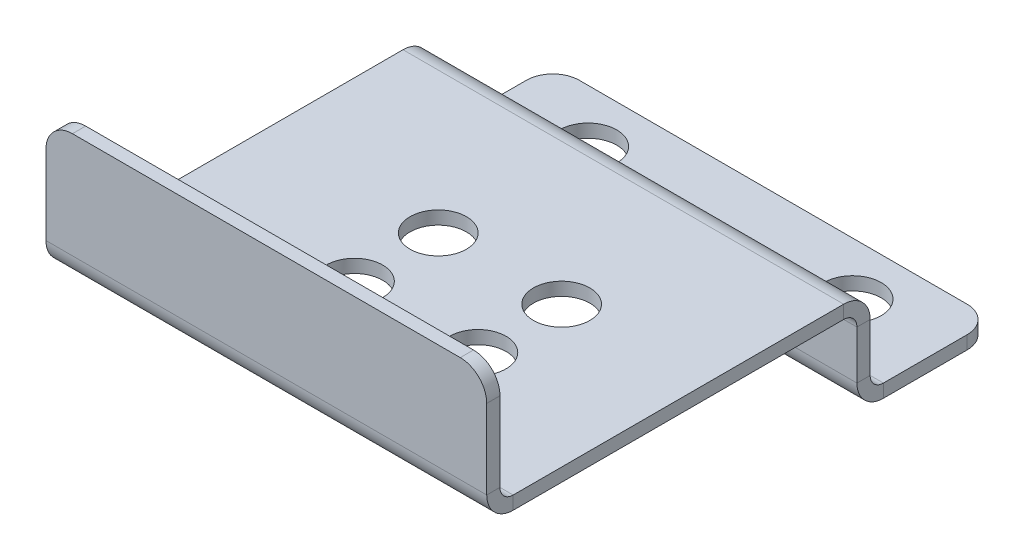
ISO-10303-21;
HEADER;
FILE_DESCRIPTION(('STEP AP214'),'2;1');
FILE_NAME('part.step','',(''),(''),'','','');
FILE_SCHEMA(('AUTOMOTIVE_DESIGN { 1 0 10303 214 1 1 1 1 }'));
ENDSEC;
DATA;
#1=APPLICATION_CONTEXT('core data for automotive mechanical design processes');
#2=APPLICATION_PROTOCOL_DEFINITION('international standard','automotive_design',2000,#1);
#3=PRODUCT_CONTEXT('',#1,'mechanical');
#4=PRODUCT('Part','Part','',(#3));
#5=PRODUCT_RELATED_PRODUCT_CATEGORY('part','',(#4));
#6=PRODUCT_DEFINITION_FORMATION('','',#4);
#7=PRODUCT_DEFINITION_CONTEXT('part definition',#1,'design');
#8=PRODUCT_DEFINITION('design','',#6,#7);
#9=PRODUCT_DEFINITION_SHAPE('','',#8);
#10=(LENGTH_UNIT() NAMED_UNIT(*) SI_UNIT(.MILLI.,.METRE.));
#11=(NAMED_UNIT(*) PLANE_ANGLE_UNIT() SI_UNIT($,.RADIAN.));
#12=(NAMED_UNIT(*) SI_UNIT($,.STERADIAN.) SOLID_ANGLE_UNIT());
#13=UNCERTAINTY_MEASURE_WITH_UNIT(LENGTH_MEASURE(1.E-05),#10,'distance_accuracy_value','');
#14=(GEOMETRIC_REPRESENTATION_CONTEXT(3) GLOBAL_UNCERTAINTY_ASSIGNED_CONTEXT((#13)) GLOBAL_UNIT_ASSIGNED_CONTEXT((#10,
#11,#12)) REPRESENTATION_CONTEXT('',''));
#15=CARTESIAN_POINT('',(0.,0.,0.));
#16=DIRECTION('',(0.,0.,1.));
#17=DIRECTION('',(1.,0.,0.));
#18=AXIS2_PLACEMENT_3D('',#15,#16,#17);
#19=CARTESIAN_POINT('',(22.,20.5,50.5));
#20=DIRECTION('',(0.,0.,-1.));
#21=DIRECTION('',(-1.,0.,0.));
#22=AXIS2_PLACEMENT_3D('',#19,#20,#21);
#23=CYLINDRICAL_SURFACE('',#22,3.);
#24=CARTESIAN_POINT('',(22.,20.5,50.5));
#25=DIRECTION('',(0.,0.,1.));
#26=DIRECTION('',(-1.,0.,0.));
#27=AXIS2_PLACEMENT_3D('',#24,#25,#26);
#28=CIRCLE('',#27,3.);
#29=CARTESIAN_POINT('',(25.,20.5,50.5));
#30=VERTEX_POINT('',#29);
#31=CARTESIAN_POINT('',(22.,23.5,50.5));
#32=VERTEX_POINT('',#31);
#33=EDGE_CURVE('E235',#30,#32,#28,.T.);
#34=ORIENTED_EDGE('',*,*,#33,.F.);
#35=DIRECTION('',(0.,0.,1.));
#36=VECTOR('',#35,1.);
#37=CARTESIAN_POINT('',(25.,20.5,50.5));
#38=LINE('',#37,#36);
#39=CARTESIAN_POINT('',(25.,20.5,49.));
#40=VERTEX_POINT('',#39);
#41=EDGE_CURVE('E856',#40,#30,#38,.T.);
#42=ORIENTED_EDGE('',*,*,#41,.F.);
#43=CARTESIAN_POINT('',(22.,20.5,49.));
#44=DIRECTION('',(0.,0.,-1.));
#45=DIRECTION('',(-1.,0.,0.));
#46=AXIS2_PLACEMENT_3D('',#43,#44,#45);
#47=CIRCLE('',#46,3.);
#48=CARTESIAN_POINT('',(22.,23.5,49.));
#49=VERTEX_POINT('',#48);
#50=EDGE_CURVE('E237',#49,#40,#47,.T.);
#51=ORIENTED_EDGE('',*,*,#50,.F.);
#52=DIRECTION('',(0.,0.,-1.));
#53=VECTOR('',#52,1.);
#54=CARTESIAN_POINT('',(22.,23.5,50.5));
#55=LINE('',#54,#53);
#56=EDGE_CURVE('E11',#32,#49,#55,.T.);
#57=ORIENTED_EDGE('',*,*,#56,.F.);
#58=EDGE_LOOP('',(#34,#42,#51,#57));
#59=FACE_BOUND('',#58,.T.);
#60=ADVANCED_FACE('F17',(#59),#23,.T.);
#61=CARTESIAN_POINT('',(-22.,20.5,50.5));
#62=DIRECTION('',(0.,0.,-1.));
#63=DIRECTION('',(-1.,0.,0.));
#64=AXIS2_PLACEMENT_3D('',#61,#62,#63);
#65=CYLINDRICAL_SURFACE('',#64,3.);
#66=CARTESIAN_POINT('',(-22.,20.5,50.5));
#67=DIRECTION('',(0.,0.,1.));
#68=DIRECTION('',(-1.,0.,0.));
#69=AXIS2_PLACEMENT_3D('',#66,#67,#68);
#70=CIRCLE('',#69,3.);
#71=CARTESIAN_POINT('',(-22.,23.5,50.5));
#72=VERTEX_POINT('',#71);
#73=CARTESIAN_POINT('',(-25.,20.5,50.5));
#74=VERTEX_POINT('',#73);
#75=EDGE_CURVE('E248',#72,#74,#70,.T.);
#76=ORIENTED_EDGE('',*,*,#75,.F.);
#77=DIRECTION('',(0.,0.,1.));
#78=VECTOR('',#77,1.);
#79=CARTESIAN_POINT('',(-22.,23.5,50.5));
#80=LINE('',#79,#78);
#81=CARTESIAN_POINT('',(-22.,23.5,49.));
#82=VERTEX_POINT('',#81);
#83=EDGE_CURVE('E26',#82,#72,#80,.T.);
#84=ORIENTED_EDGE('',*,*,#83,.F.);
#85=CARTESIAN_POINT('',(-22.,20.5,49.));
#86=DIRECTION('',(0.,0.,-1.));
#87=DIRECTION('',(-1.,0.,0.));
#88=AXIS2_PLACEMENT_3D('',#85,#86,#87);
#89=CIRCLE('',#88,3.);
#90=CARTESIAN_POINT('',(-25.,20.5,49.));
#91=VERTEX_POINT('',#90);
#92=EDGE_CURVE('E247',#91,#82,#89,.T.);
#93=ORIENTED_EDGE('',*,*,#92,.F.);
#94=DIRECTION('',(0.,0.,-1.));
#95=VECTOR('',#94,1.);
#96=CARTESIAN_POINT('',(-25.,20.5,50.5));
#97=LINE('',#96,#95);
#98=EDGE_CURVE('E260',#74,#91,#97,.T.);
#99=ORIENTED_EDGE('',*,*,#98,.F.);
#100=EDGE_LOOP('',(#76,#84,#93,#99));
#101=FACE_BOUND('',#100,.T.);
#102=ADVANCED_FACE('F1109',(#101),#65,.T.);
#103=CARTESIAN_POINT('',(-5.,10.,26.));
#104=DIRECTION('',(0.,1.,0.));
#105=DIRECTION('',(0.,0.,1.));
#106=AXIS2_PLACEMENT_3D('',#103,#104,#105);
#107=CYLINDRICAL_SURFACE('',#106,3.2);
#108=CARTESIAN_POINT('',(-5.,8.5,26.));
#109=DIRECTION('',(0.,-1.,0.));
#110=DIRECTION('',(0.,0.,-1.));
#111=AXIS2_PLACEMENT_3D('',#108,#109,#110);
#112=CIRCLE('',#111,3.2);
#113=CARTESIAN_POINT('',(-5.,8.5,22.8));
#114=VERTEX_POINT('',#113);
#115=EDGE_CURVE('E409',#114,#114,#112,.T.);
#116=ORIENTED_EDGE('',*,*,#115,.T.);
#117=EDGE_LOOP('',(#116));
#118=FACE_BOUND('',#117,.T.);
#119=CARTESIAN_POINT('',(-5.,10.,26.));
#120=DIRECTION('',(0.,1.,0.));
#121=DIRECTION('',(0.,0.,1.));
#122=AXIS2_PLACEMENT_3D('',#119,#120,#121);
#123=CIRCLE('',#122,3.2);
#124=CARTESIAN_POINT('',(-5.,10.,29.2));
#125=VERTEX_POINT('',#124);
#126=EDGE_CURVE('E432',#125,#125,#123,.T.);
#127=ORIENTED_EDGE('',*,*,#126,.T.);
#128=EDGE_LOOP('',(#127));
#129=FACE_BOUND('',#128,.T.);
#130=ADVANCED_FACE('F19',(#118,#129),#107,.F.);
#131=CARTESIAN_POINT('',(9.,10.,26.));
#132=DIRECTION('',(0.,1.,0.));
#133=DIRECTION('',(0.,0.,1.));
#134=AXIS2_PLACEMENT_3D('',#131,#132,#133);
#135=CYLINDRICAL_SURFACE('',#134,3.2);
#136=CARTESIAN_POINT('',(9.,8.5,26.));
#137=DIRECTION('',(0.,-1.,0.));
#138=DIRECTION('',(0.,0.,-1.));
#139=AXIS2_PLACEMENT_3D('',#136,#137,#138);
#140=CIRCLE('',#139,3.2);
#141=CARTESIAN_POINT('',(9.,8.5,22.8));
#142=VERTEX_POINT('',#141);
#143=EDGE_CURVE('E440',#142,#142,#140,.T.);
#144=ORIENTED_EDGE('',*,*,#143,.T.);
#145=EDGE_LOOP('',(#144));
#146=FACE_BOUND('',#145,.T.);
#147=CARTESIAN_POINT('',(9.,10.,26.));
#148=DIRECTION('',(0.,1.,0.));
#149=DIRECTION('',(0.,0.,1.));
#150=AXIS2_PLACEMENT_3D('',#147,#148,#149);
#151=CIRCLE('',#150,3.2);
#152=CARTESIAN_POINT('',(9.,10.,29.2));
#153=VERTEX_POINT('',#152);
#154=EDGE_CURVE('E428',#153,#153,#151,.T.);
#155=ORIENTED_EDGE('',*,*,#154,.T.);
#156=EDGE_LOOP('',(#155));
#157=FACE_BOUND('',#156,.T.);
#158=ADVANCED_FACE('F1226',(#146,#157),#135,.F.);
#159=CARTESIAN_POINT('',(9.,10.,35.5));
#160=DIRECTION('',(0.,1.,0.));
#161=DIRECTION('',(0.,0.,1.));
#162=AXIS2_PLACEMENT_3D('',#159,#160,#161);
#163=CYLINDRICAL_SURFACE('',#162,3.2);
#164=CARTESIAN_POINT('',(9.,8.5000000000001,35.5));
#165=DIRECTION('',(0.,-1.,0.));
#166=DIRECTION('',(0.,0.,-1.));
#167=AXIS2_PLACEMENT_3D('',#164,#165,#166);
#168=CIRCLE('',#167,3.2);
#169=CARTESIAN_POINT('',(9.,8.5,32.3));
#170=VERTEX_POINT('',#169);
#171=EDGE_CURVE('E461',#170,#170,#168,.T.);
#172=ORIENTED_EDGE('',*,*,#171,.T.);
#173=EDGE_LOOP('',(#172));
#174=FACE_BOUND('',#173,.T.);
#175=CARTESIAN_POINT('',(9.,10.,35.5));
#176=DIRECTION('',(0.,1.,0.));
#177=DIRECTION('',(0.,0.,1.));
#178=AXIS2_PLACEMENT_3D('',#175,#176,#177);
#179=CIRCLE('',#178,3.2);
#180=CARTESIAN_POINT('',(9.,10.,38.7));
#181=VERTEX_POINT('',#180);
#182=EDGE_CURVE('E319',#181,#181,#179,.T.);
#183=ORIENTED_EDGE('',*,*,#182,.T.);
#184=EDGE_LOOP('',(#183));
#185=FACE_BOUND('',#184,.T.);
#186=ADVANCED_FACE('F1127',(#174,#185),#163,.F.);
#187=CARTESIAN_POINT('',(-5.,10.,35.5));
#188=DIRECTION('',(0.,1.,0.));
#189=DIRECTION('',(0.,0.,1.));
#190=AXIS2_PLACEMENT_3D('',#187,#188,#189);
#191=CYLINDRICAL_SURFACE('',#190,3.2);
#192=CARTESIAN_POINT('',(-5.,8.5000000000001,35.5));
#193=DIRECTION('',(0.,-1.,0.));
#194=DIRECTION('',(0.,0.,-1.));
#195=AXIS2_PLACEMENT_3D('',#192,#193,#194);
#196=CIRCLE('',#195,3.2);
#197=CARTESIAN_POINT('',(-5.,8.5,32.3));
#198=VERTEX_POINT('',#197);
#199=EDGE_CURVE('E469',#198,#198,#196,.T.);
#200=ORIENTED_EDGE('',*,*,#199,.T.);
#201=EDGE_LOOP('',(#200));
#202=FACE_BOUND('',#201,.T.);
#203=CARTESIAN_POINT('',(-5.,10.,35.5));
#204=DIRECTION('',(0.,1.,0.));
#205=DIRECTION('',(0.,0.,1.));
#206=AXIS2_PLACEMENT_3D('',#203,#204,#205);
#207=CIRCLE('',#206,3.2);
#208=CARTESIAN_POINT('',(-5.,10.,38.7));
#209=VERTEX_POINT('',#208);
#210=EDGE_CURVE('E314',#209,#209,#207,.T.);
#211=ORIENTED_EDGE('',*,*,#210,.T.);
#212=EDGE_LOOP('',(#211));
#213=FACE_BOUND('',#212,.T.);
#214=ADVANCED_FACE('F1123',(#202,#213),#191,.F.);
#215=CARTESIAN_POINT('',(-25.,23.5,50.5));
#216=DIRECTION('',(0.,-1.,0.));
#217=DIRECTION('',(0.,0.,-1.));
#218=AXIS2_PLACEMENT_3D('',#215,#216,#217);
#219=PLANE('',#218);
#220=DIRECTION('',(-1.,0.,0.));
#221=VECTOR('',#220,1.);
#222=CARTESIAN_POINT('',(-25.,23.5,49.));
#223=LINE('',#222,#221);
#224=EDGE_CURVE('E267',#49,#82,#223,.T.);
#225=ORIENTED_EDGE('',*,*,#224,.T.);
#226=ORIENTED_EDGE('',*,*,#83,.T.);
#227=DIRECTION('',(-1.,0.,0.));
#228=VECTOR('',#227,1.);
#229=CARTESIAN_POINT('',(-25.,23.5,50.5));
#230=LINE('',#229,#228);
#231=EDGE_CURVE('E242',#32,#72,#230,.T.);
#232=ORIENTED_EDGE('',*,*,#231,.F.);
#233=ORIENTED_EDGE('',*,*,#56,.T.);
#234=EDGE_LOOP('',(#225,#226,#232,#233));
#235=FACE_BOUND('',#234,.T.);
#236=ADVANCED_FACE('F250',(#235),#219,.F.);
#237=CARTESIAN_POINT('',(0.,0.,49.));
#238=DIRECTION('',(0.,0.,-1.));
#239=DIRECTION('',(0.,-1.,0.));
#240=AXIS2_PLACEMENT_3D('',#237,#238,#239);
#241=PLANE('',#240);
#242=DIRECTION('',(0.,-1.,0.));
#243=VECTOR('',#242,1.);
#244=CARTESIAN_POINT('',(-25.,10.0000000000001,49.));
#245=LINE('',#244,#243);
#246=CARTESIAN_POINT('',(-25.,11.5000000000001,49.));
#247=VERTEX_POINT('',#246);
#248=EDGE_CURVE('E252',#91,#247,#245,.T.);
#249=ORIENTED_EDGE('',*,*,#248,.F.);
#250=ORIENTED_EDGE('',*,*,#92,.T.);
#251=ORIENTED_EDGE('',*,*,#224,.F.);
#252=ORIENTED_EDGE('',*,*,#50,.T.);
#253=DIRECTION('',(0.,1.,0.));
#254=VECTOR('',#253,1.);
#255=CARTESIAN_POINT('',(25.,23.5,49.));
#256=LINE('',#255,#254);
#257=CARTESIAN_POINT('',(25.,11.5000000000001,49.));
#258=VERTEX_POINT('',#257);
#259=EDGE_CURVE('E850',#258,#40,#256,.T.);
#260=ORIENTED_EDGE('',*,*,#259,.F.);
#261=DIRECTION('',(1.,0.,0.));
#262=VECTOR('',#261,1.);
#263=CARTESIAN_POINT('',(-25.,11.5000000000001,49.));
#264=LINE('',#263,#262);
#265=EDGE_CURVE('E841',#247,#258,#264,.T.);
#266=ORIENTED_EDGE('',*,*,#265,.F.);
#267=EDGE_LOOP('',(#249,#250,#251,#252,#260,#266));
#268=FACE_BOUND('',#267,.T.);
#269=ADVANCED_FACE('F1203',(#268),#241,.T.);
#270=CARTESIAN_POINT('',(0.,0.,50.5));
#271=DIRECTION('',(0.,0.,-1.));
#272=DIRECTION('',(0.,-1.,0.));
#273=AXIS2_PLACEMENT_3D('',#270,#271,#272);
#274=PLANE('',#273);
#275=ORIENTED_EDGE('',*,*,#231,.T.);
#276=ORIENTED_EDGE('',*,*,#75,.T.);
#277=DIRECTION('',(0.,-1.,0.));
#278=VECTOR('',#277,1.);
#279=CARTESIAN_POINT('',(-25.,10.0000000000001,50.5));
#280=LINE('',#279,#278);
#281=CARTESIAN_POINT('',(-25.,11.5000000000001,50.5));
#282=VERTEX_POINT('',#281);
#283=EDGE_CURVE('E867',#74,#282,#280,.T.);
#284=ORIENTED_EDGE('',*,*,#283,.T.);
#285=DIRECTION('',(-1.,0.,0.));
#286=VECTOR('',#285,1.);
#287=CARTESIAN_POINT('',(0.,11.5000000000001,50.5));
#288=LINE('',#287,#286);
#289=CARTESIAN_POINT('',(25.,11.5000000000001,50.5));
#290=VERTEX_POINT('',#289);
#291=EDGE_CURVE('E832',#290,#282,#288,.T.);
#292=ORIENTED_EDGE('',*,*,#291,.F.);
#293=DIRECTION('',(0.,1.,0.));
#294=VECTOR('',#293,1.);
#295=CARTESIAN_POINT('',(25.,23.5,50.5));
#296=LINE('',#295,#294);
#297=EDGE_CURVE('E244',#290,#30,#296,.T.);
#298=ORIENTED_EDGE('',*,*,#297,.T.);
#299=ORIENTED_EDGE('',*,*,#33,.T.);
#300=EDGE_LOOP('',(#275,#276,#284,#292,#298,#299));
#301=FACE_BOUND('',#300,.T.);
#302=ADVANCED_FACE('F241',(#301),#274,.F.);
#303=CARTESIAN_POINT('',(-25.,10.0000000000001,50.5));
#304=DIRECTION('',(1.,0.,0.));
#305=DIRECTION('',(0.,1.,0.));
#306=AXIS2_PLACEMENT_3D('',#303,#304,#305);
#307=PLANE('',#306);
#308=ORIENTED_EDGE('',*,*,#283,.F.);
#309=ORIENTED_EDGE('',*,*,#98,.T.);
#310=ORIENTED_EDGE('',*,*,#248,.T.);
#311=DIRECTION('',(0.,0.,1.));
#312=VECTOR('',#311,1.);
#313=CARTESIAN_POINT('',(-25.,11.5000000000001,49.));
#314=LINE('',#313,#312);
#315=EDGE_CURVE('E795',#247,#282,#314,.T.);
#316=ORIENTED_EDGE('',*,*,#315,.T.);
#317=EDGE_LOOP('',(#308,#309,#310,#316));
#318=FACE_BOUND('',#317,.T.);
#319=ADVANCED_FACE('F1186',(#318),#307,.F.);
#320=CARTESIAN_POINT('',(25.,23.5,50.5));
#321=DIRECTION('',(-1.,0.,0.));
#322=DIRECTION('',(0.,0.,1.));
#323=AXIS2_PLACEMENT_3D('',#320,#321,#322);
#324=PLANE('',#323);
#325=ORIENTED_EDGE('',*,*,#259,.T.);
#326=ORIENTED_EDGE('',*,*,#41,.T.);
#327=ORIENTED_EDGE('',*,*,#297,.F.);
#328=DIRECTION('',(0.,0.,1.));
#329=VECTOR('',#328,1.);
#330=CARTESIAN_POINT('',(25.,11.5000000000001,49.));
#331=LINE('',#330,#329);
#332=EDGE_CURVE('E415',#258,#290,#331,.T.);
#333=ORIENTED_EDGE('',*,*,#332,.F.);
#334=EDGE_LOOP('',(#325,#326,#327,#333));
#335=FACE_BOUND('',#334,.T.);
#336=ADVANCED_FACE('F1177',(#335),#324,.F.);
#337=CARTESIAN_POINT('',(25.,11.5000000000001,47.5));
#338=DIRECTION('',(1.,0.,0.));
#339=DIRECTION('',(0.,0.,1.));
#340=AXIS2_PLACEMENT_3D('',#337,#338,#339);
#341=CYLINDRICAL_SURFACE('',#340,1.5);
#342=DIRECTION('',(-1.,0.,0.));
#343=VECTOR('',#342,1.);
#344=CARTESIAN_POINT('',(25.,10.0000000000001,47.5));
#345=LINE('',#344,#343);
#346=CARTESIAN_POINT('',(25.,10.0000000000001,47.5));
#347=VERTEX_POINT('',#346);
#348=CARTESIAN_POINT('',(-25.,10.0000000000001,47.5));
#349=VERTEX_POINT('',#348);
#350=EDGE_CURVE('E326',#347,#349,#345,.T.);
#351=ORIENTED_EDGE('',*,*,#350,.T.);
#352=CARTESIAN_POINT('',(-25.,11.5000000000001,47.5));
#353=DIRECTION('',(-1.,0.,0.));
#354=DIRECTION('',(0.,0.,-1.));
#355=AXIS2_PLACEMENT_3D('',#352,#353,#354);
#356=CIRCLE('',#355,1.5);
#357=EDGE_CURVE('E803',#349,#247,#356,.T.);
#358=ORIENTED_EDGE('',*,*,#357,.T.);
#359=ORIENTED_EDGE('',*,*,#265,.T.);
#360=CARTESIAN_POINT('',(25.,11.5000000000001,47.5));
#361=DIRECTION('',(1.,0.,0.));
#362=DIRECTION('',(0.,0.,-1.));
#363=AXIS2_PLACEMENT_3D('',#360,#361,#362);
#364=CIRCLE('',#363,1.5);
#365=EDGE_CURVE('E421',#258,#347,#364,.T.);
#366=ORIENTED_EDGE('',*,*,#365,.T.);
#367=EDGE_LOOP('',(#351,#358,#359,#366));
#368=FACE_BOUND('',#367,.T.);
#369=ADVANCED_FACE('F1015',(#368),#341,.F.);
#370=CARTESIAN_POINT('',(25.,11.5000000000001,47.5));
#371=DIRECTION('',(1.,0.,0.));
#372=DIRECTION('',(0.,0.,1.));
#373=AXIS2_PLACEMENT_3D('',#370,#371,#372);
#374=CYLINDRICAL_SURFACE('',#373,3.);
#375=DIRECTION('',(-1.,0.,0.));
#376=VECTOR('',#375,1.);
#377=CARTESIAN_POINT('',(25.,8.50000000000014,47.5));
#378=LINE('',#377,#376);
#379=CARTESIAN_POINT('',(25.,8.50000000000014,47.5));
#380=VERTEX_POINT('',#379);
#381=CARTESIAN_POINT('',(-25.,8.50000000000014,47.5));
#382=VERTEX_POINT('',#381);
#383=EDGE_CURVE('E318',#380,#382,#378,.T.);
#384=ORIENTED_EDGE('',*,*,#383,.F.);
#385=CARTESIAN_POINT('',(25.,11.5000000000001,47.5));
#386=DIRECTION('',(1.,0.,0.));
#387=DIRECTION('',(0.,0.,-1.));
#388=AXIS2_PLACEMENT_3D('',#385,#386,#387);
#389=CIRCLE('',#388,3.);
#390=EDGE_CURVE('E420',#290,#380,#389,.T.);
#391=ORIENTED_EDGE('',*,*,#390,.F.);
#392=ORIENTED_EDGE('',*,*,#291,.T.);
#393=CARTESIAN_POINT('',(-25.,11.5000000000001,47.5));
#394=DIRECTION('',(-1.,0.,0.));
#395=DIRECTION('',(0.,0.,-1.));
#396=AXIS2_PLACEMENT_3D('',#393,#394,#395);
#397=CIRCLE('',#396,3.);
#398=EDGE_CURVE('E811',#382,#282,#397,.T.);
#399=ORIENTED_EDGE('',*,*,#398,.F.);
#400=EDGE_LOOP('',(#384,#391,#392,#399));
#401=FACE_BOUND('',#400,.T.);
#402=ADVANCED_FACE('F1010',(#401),#374,.T.);
#403=CARTESIAN_POINT('',(25.,11.5000000000001,47.5));
#404=DIRECTION('',(-1.,0.,0.));
#405=DIRECTION('',(0.,0.,1.));
#406=AXIS2_PLACEMENT_3D('',#403,#404,#405);
#407=PLANE('',#406);
#408=ORIENTED_EDGE('',*,*,#365,.F.);
#409=ORIENTED_EDGE('',*,*,#332,.T.);
#410=ORIENTED_EDGE('',*,*,#390,.T.);
#411=DIRECTION('',(0.,-1.,0.));
#412=VECTOR('',#411,1.);
#413=CARTESIAN_POINT('',(25.,10.0000000000001,47.5));
#414=LINE('',#413,#412);
#415=EDGE_CURVE('E1466',#347,#380,#414,.T.);
#416=ORIENTED_EDGE('',*,*,#415,.F.);
#417=EDGE_LOOP('',(#408,#409,#410,#416));
#418=FACE_BOUND('',#417,.T.);
#419=ADVANCED_FACE('F1014',(#418),#407,.F.);
#420=CARTESIAN_POINT('',(-25.,11.5000000000001,47.5));
#421=DIRECTION('',(-1.,0.,0.));
#422=DIRECTION('',(0.,0.,1.));
#423=AXIS2_PLACEMENT_3D('',#420,#421,#422);
#424=PLANE('',#423);
#425=ORIENTED_EDGE('',*,*,#315,.F.);
#426=ORIENTED_EDGE('',*,*,#357,.F.);
#427=DIRECTION('',(0.,-1.,0.));
#428=VECTOR('',#427,1.);
#429=CARTESIAN_POINT('',(-25.,10.0000000000001,47.5));
#430=LINE('',#429,#428);
#431=EDGE_CURVE('E339',#349,#382,#430,.T.);
#432=ORIENTED_EDGE('',*,*,#431,.T.);
#433=ORIENTED_EDGE('',*,*,#398,.T.);
#434=EDGE_LOOP('',(#425,#426,#432,#433));
#435=FACE_BOUND('',#434,.T.);
#436=ADVANCED_FACE('F1145',(#435),#424,.T.);
#437=CARTESIAN_POINT('',(22.,-1.5,-4.));
#438=DIRECTION('',(0.,1.,0.));
#439=DIRECTION('',(0.,0.,1.));
#440=AXIS2_PLACEMENT_3D('',#437,#438,#439);
#441=CYLINDRICAL_SURFACE('',#440,3.);
#442=CARTESIAN_POINT('',(22.,-1.5,-4.));
#443=DIRECTION('',(0.,-1.,0.));
#444=DIRECTION('',(0.,0.,1.));
#445=AXIS2_PLACEMENT_3D('',#442,#443,#444);
#446=CIRCLE('',#445,3.);
#447=CARTESIAN_POINT('',(22.,-1.5,-7.));
#448=VERTEX_POINT('',#447);
#449=CARTESIAN_POINT('',(25.,-1.5,-4.));
#450=VERTEX_POINT('',#449);
#451=EDGE_CURVE('E657',#448,#450,#446,.T.);
#452=ORIENTED_EDGE('',*,*,#451,.F.);
#453=DIRECTION('',(0.,-1.,0.));
#454=VECTOR('',#453,1.);
#455=CARTESIAN_POINT('',(22.,-1.5,-7.));
#456=LINE('',#455,#454);
#457=CARTESIAN_POINT('',(22.,0.,-7.));
#458=VERTEX_POINT('',#457);
#459=EDGE_CURVE('E730',#458,#448,#456,.T.);
#460=ORIENTED_EDGE('',*,*,#459,.F.);
#461=CARTESIAN_POINT('',(22.,0.,-4.));
#462=DIRECTION('',(0.,1.,0.));
#463=DIRECTION('',(0.,0.,1.));
#464=AXIS2_PLACEMENT_3D('',#461,#462,#463);
#465=CIRCLE('',#464,3.);
#466=CARTESIAN_POINT('',(25.,0.,-4.));
#467=VERTEX_POINT('',#466);
#468=EDGE_CURVE('E695',#467,#458,#465,.T.);
#469=ORIENTED_EDGE('',*,*,#468,.F.);
#470=DIRECTION('',(0.,1.,0.));
#471=VECTOR('',#470,1.);
#472=CARTESIAN_POINT('',(25.,-1.5,-4.));
#473=LINE('',#472,#471);
#474=EDGE_CURVE('E577',#450,#467,#473,.T.);
#475=ORIENTED_EDGE('',*,*,#474,.F.);
#476=EDGE_LOOP('',(#452,#460,#469,#475));
#477=FACE_BOUND('',#476,.T.);
#478=ADVANCED_FACE('F1136',(#477),#441,.T.);
#479=CARTESIAN_POINT('',(-22.,-1.5,-4.));
#480=DIRECTION('',(0.,1.,0.));
#481=DIRECTION('',(0.,0.,1.));
#482=AXIS2_PLACEMENT_3D('',#479,#480,#481);
#483=CYLINDRICAL_SURFACE('',#482,3.);
#484=CARTESIAN_POINT('',(-22.,-1.5,-4.));
#485=DIRECTION('',(0.,-1.,0.));
#486=DIRECTION('',(0.,0.,1.));
#487=AXIS2_PLACEMENT_3D('',#484,#485,#486);
#488=CIRCLE('',#487,3.);
#489=CARTESIAN_POINT('',(-25.,-1.5,-4.));
#490=VERTEX_POINT('',#489);
#491=CARTESIAN_POINT('',(-22.,-1.5,-7.));
#492=VERTEX_POINT('',#491);
#493=EDGE_CURVE('E616',#490,#492,#488,.T.);
#494=ORIENTED_EDGE('',*,*,#493,.F.);
#495=DIRECTION('',(0.,-1.,0.));
#496=VECTOR('',#495,1.);
#497=CARTESIAN_POINT('',(-25.,-1.5,-4.));
#498=LINE('',#497,#496);
#499=CARTESIAN_POINT('',(-25.,0.,-4.));
#500=VERTEX_POINT('',#499);
#501=EDGE_CURVE('E628',#500,#490,#498,.T.);
#502=ORIENTED_EDGE('',*,*,#501,.F.);
#503=CARTESIAN_POINT('',(-22.,0.,-4.));
#504=DIRECTION('',(0.,1.,0.));
#505=DIRECTION('',(0.,0.,1.));
#506=AXIS2_PLACEMENT_3D('',#503,#504,#505);
#507=CIRCLE('',#506,3.);
#508=CARTESIAN_POINT('',(-22.,0.,-7.));
#509=VERTEX_POINT('',#508);
#510=EDGE_CURVE('E451',#509,#500,#507,.T.);
#511=ORIENTED_EDGE('',*,*,#510,.F.);
#512=DIRECTION('',(0.,1.,0.));
#513=VECTOR('',#512,1.);
#514=CARTESIAN_POINT('',(-22.,-1.5,-7.));
#515=LINE('',#514,#513);
#516=EDGE_CURVE('E627',#492,#509,#515,.T.);
#517=ORIENTED_EDGE('',*,*,#516,.F.);
#518=EDGE_LOOP('',(#494,#502,#511,#517));
#519=FACE_BOUND('',#518,.T.);
#520=ADVANCED_FACE('F1117',(#519),#483,.T.);
#521=CARTESIAN_POINT('',(-25.,7.,10.));
#522=DIRECTION('',(-1.,0.,0.));
#523=DIRECTION('',(0.,1.,0.));
#524=AXIS2_PLACEMENT_3D('',#521,#522,#523);
#525=CYLINDRICAL_SURFACE('',#524,1.5);
#526=DIRECTION('',(1.,0.,0.));
#527=VECTOR('',#526,1.);
#528=CARTESIAN_POINT('',(-25.,7.,8.5));
#529=LINE('',#528,#527);
#530=CARTESIAN_POINT('',(-25.,7.,8.5));
#531=VERTEX_POINT('',#530);
#532=CARTESIAN_POINT('',(25.,7.,8.5));
#533=VERTEX_POINT('',#532);
#534=EDGE_CURVE('E373',#531,#533,#529,.T.);
#535=ORIENTED_EDGE('',*,*,#534,.T.);
#536=CARTESIAN_POINT('',(25.,7.,10.));
#537=DIRECTION('',(1.,0.,0.));
#538=DIRECTION('',(0.,0.,1.));
#539=AXIS2_PLACEMENT_3D('',#536,#537,#538);
#540=CIRCLE('',#539,1.5);
#541=CARTESIAN_POINT('',(25.,8.5,10.));
#542=VERTEX_POINT('',#541);
#543=EDGE_CURVE('E764',#533,#542,#540,.T.);
#544=ORIENTED_EDGE('',*,*,#543,.T.);
#545=DIRECTION('',(-1.,0.,0.));
#546=VECTOR('',#545,1.);
#547=CARTESIAN_POINT('',(25.,8.5,10.));
#548=LINE('',#547,#546);
#549=CARTESIAN_POINT('',(-25.,8.5,10.));
#550=VERTEX_POINT('',#549);
#551=EDGE_CURVE('E353',#542,#550,#548,.T.);
#552=ORIENTED_EDGE('',*,*,#551,.T.);
#553=CARTESIAN_POINT('',(-25.,7.,10.));
#554=DIRECTION('',(-1.,0.,0.));
#555=DIRECTION('',(0.,0.,1.));
#556=AXIS2_PLACEMENT_3D('',#553,#554,#555);
#557=CIRCLE('',#556,1.5);
#558=EDGE_CURVE('E780',#550,#531,#557,.T.);
#559=ORIENTED_EDGE('',*,*,#558,.T.);
#560=EDGE_LOOP('',(#535,#544,#552,#559));
#561=FACE_BOUND('',#560,.T.);
#562=ADVANCED_FACE('F924',(#561),#525,.F.);
#563=CARTESIAN_POINT('',(-25.,7.,10.));
#564=DIRECTION('',(-1.,0.,0.));
#565=DIRECTION('',(0.,1.,0.));
#566=AXIS2_PLACEMENT_3D('',#563,#564,#565);
#567=CYLINDRICAL_SURFACE('',#566,3.);
#568=DIRECTION('',(1.,0.,0.));
#569=VECTOR('',#568,1.);
#570=CARTESIAN_POINT('',(-25.,7.,7.));
#571=LINE('',#570,#569);
#572=CARTESIAN_POINT('',(-25.,7.,7.));
#573=VERTEX_POINT('',#572);
#574=CARTESIAN_POINT('',(25.,7.,7.));
#575=VERTEX_POINT('',#574);
#576=EDGE_CURVE('E400',#573,#575,#571,.T.);
#577=ORIENTED_EDGE('',*,*,#576,.F.);
#578=CARTESIAN_POINT('',(-25.,7.,10.));
#579=DIRECTION('',(-1.,0.,0.));
#580=DIRECTION('',(0.,0.,1.));
#581=AXIS2_PLACEMENT_3D('',#578,#579,#580);
#582=CIRCLE('',#581,3.);
#583=CARTESIAN_POINT('',(-25.,10.,10.));
#584=VERTEX_POINT('',#583);
#585=EDGE_CURVE('E788',#584,#573,#582,.T.);
#586=ORIENTED_EDGE('',*,*,#585,.F.);
#587=DIRECTION('',(1.,0.,0.));
#588=VECTOR('',#587,1.);
#589=CARTESIAN_POINT('',(0.,10.,10.));
#590=LINE('',#589,#588);
#591=CARTESIAN_POINT('',(25.,10.,10.));
#592=VERTEX_POINT('',#591);
#593=EDGE_CURVE('E331',#584,#592,#590,.T.);
#594=ORIENTED_EDGE('',*,*,#593,.T.);
#595=CARTESIAN_POINT('',(25.,7.,10.));
#596=DIRECTION('',(1.,0.,0.));
#597=DIRECTION('',(0.,0.,1.));
#598=AXIS2_PLACEMENT_3D('',#595,#596,#597);
#599=CIRCLE('',#598,3.);
#600=EDGE_CURVE('E772',#575,#592,#599,.T.);
#601=ORIENTED_EDGE('',*,*,#600,.F.);
#602=EDGE_LOOP('',(#577,#586,#594,#601));
#603=FACE_BOUND('',#602,.T.);
#604=ADVANCED_FACE('F919',(#603),#567,.T.);
#605=CARTESIAN_POINT('',(-25.,7.,10.));
#606=DIRECTION('',(1.,0.,0.));
#607=DIRECTION('',(0.,1.,0.));
#608=AXIS2_PLACEMENT_3D('',#605,#606,#607);
#609=PLANE('',#608);
#610=ORIENTED_EDGE('',*,*,#558,.F.);
#611=DIRECTION('',(0.,1.,0.));
#612=VECTOR('',#611,1.);
#613=CARTESIAN_POINT('',(-25.,8.5,10.));
#614=LINE('',#613,#612);
#615=EDGE_CURVE('E362',#550,#584,#614,.T.);
#616=ORIENTED_EDGE('',*,*,#615,.T.);
#617=ORIENTED_EDGE('',*,*,#585,.T.);
#618=DIRECTION('',(0.,0.,-1.));
#619=VECTOR('',#618,1.);
#620=CARTESIAN_POINT('',(-25.,7.,8.5));
#621=LINE('',#620,#619);
#622=EDGE_CURVE('E522',#531,#573,#621,.T.);
#623=ORIENTED_EDGE('',*,*,#622,.F.);
#624=EDGE_LOOP('',(#610,#616,#617,#623));
#625=FACE_BOUND('',#624,.T.);
#626=ADVANCED_FACE('F923',(#625),#609,.F.);
#627=CARTESIAN_POINT('',(25.,7.,10.));
#628=DIRECTION('',(1.,0.,0.));
#629=DIRECTION('',(0.,1.,0.));
#630=AXIS2_PLACEMENT_3D('',#627,#628,#629);
#631=PLANE('',#630);
#632=DIRECTION('',(0.,1.,0.));
#633=VECTOR('',#632,1.);
#634=CARTESIAN_POINT('',(25.,8.5,10.));
#635=LINE('',#634,#633);
#636=EDGE_CURVE('E1475',#542,#592,#635,.T.);
#637=ORIENTED_EDGE('',*,*,#636,.F.);
#638=ORIENTED_EDGE('',*,*,#543,.F.);
#639=DIRECTION('',(0.,0.,-1.));
#640=VECTOR('',#639,1.);
#641=CARTESIAN_POINT('',(25.,7.,8.5));
#642=LINE('',#641,#640);
#643=EDGE_CURVE('E486',#533,#575,#642,.T.);
#644=ORIENTED_EDGE('',*,*,#643,.T.);
#645=ORIENTED_EDGE('',*,*,#600,.T.);
#646=EDGE_LOOP('',(#637,#638,#644,#645));
#647=FACE_BOUND('',#646,.T.);
#648=ADVANCED_FACE('F1084',(#647),#631,.T.);
#649=CARTESIAN_POINT('',(25.,1.5,5.5));
#650=DIRECTION('',(1.,0.,0.));
#651=DIRECTION('',(0.,0.,1.));
#652=AXIS2_PLACEMENT_3D('',#649,#650,#651);
#653=CYLINDRICAL_SURFACE('',#652,1.5);
#654=DIRECTION('',(-1.,0.,0.));
#655=VECTOR('',#654,1.);
#656=CARTESIAN_POINT('',(25.,0.,5.5));
#657=LINE('',#656,#655);
#658=CARTESIAN_POINT('',(25.,0.,5.5));
#659=VERTEX_POINT('',#658);
#660=CARTESIAN_POINT('',(-25.,0.,5.5));
#661=VERTEX_POINT('',#660);
#662=EDGE_CURVE('E690',#659,#661,#657,.T.);
#663=ORIENTED_EDGE('',*,*,#662,.T.);
#664=CARTESIAN_POINT('',(-25.,1.5,5.5));
#665=DIRECTION('',(-1.,0.,0.));
#666=DIRECTION('',(0.,0.,-1.));
#667=AXIS2_PLACEMENT_3D('',#664,#665,#666);
#668=CIRCLE('',#667,1.5);
#669=CARTESIAN_POINT('',(-25.,1.5,7.));
#670=VERTEX_POINT('',#669);
#671=EDGE_CURVE('E744',#661,#670,#668,.T.);
#672=ORIENTED_EDGE('',*,*,#671,.T.);
#673=DIRECTION('',(1.,0.,0.));
#674=VECTOR('',#673,1.);
#675=CARTESIAN_POINT('',(-25.,1.5,7.));
#676=LINE('',#675,#674);
#677=CARTESIAN_POINT('',(25.,1.5,7.));
#678=VERTEX_POINT('',#677);
#679=EDGE_CURVE('E554',#670,#678,#676,.T.);
#680=ORIENTED_EDGE('',*,*,#679,.T.);
#681=CARTESIAN_POINT('',(25.,1.5,5.5));
#682=DIRECTION('',(1.,0.,0.));
#683=DIRECTION('',(0.,0.,-1.));
#684=AXIS2_PLACEMENT_3D('',#681,#682,#683);
#685=CIRCLE('',#684,1.5);
#686=EDGE_CURVE('E671',#678,#659,#685,.T.);
#687=ORIENTED_EDGE('',*,*,#686,.T.);
#688=EDGE_LOOP('',(#663,#672,#680,#687));
#689=FACE_BOUND('',#688,.T.);
#690=ADVANCED_FACE('F1075',(#689),#653,.F.);
#691=CARTESIAN_POINT('',(25.,1.5,5.5));
#692=DIRECTION('',(1.,0.,0.));
#693=DIRECTION('',(0.,0.,1.));
#694=AXIS2_PLACEMENT_3D('',#691,#692,#693);
#695=CYLINDRICAL_SURFACE('',#694,3.);
#696=DIRECTION('',(-1.,0.,0.));
#697=VECTOR('',#696,1.);
#698=CARTESIAN_POINT('',(25.,-1.5,5.5));
#699=LINE('',#698,#697);
#700=CARTESIAN_POINT('',(25.,-1.5,5.5));
#701=VERTEX_POINT('',#700);
#702=CARTESIAN_POINT('',(-25.,-1.5,5.5));
#703=VERTEX_POINT('',#702);
#704=EDGE_CURVE('E665',#701,#703,#699,.T.);
#705=ORIENTED_EDGE('',*,*,#704,.F.);
#706=CARTESIAN_POINT('',(25.,1.5,5.5));
#707=DIRECTION('',(1.,0.,0.));
#708=DIRECTION('',(0.,0.,-1.));
#709=AXIS2_PLACEMENT_3D('',#706,#707,#708);
#710=CIRCLE('',#709,3.);
#711=CARTESIAN_POINT('',(25.,1.5,8.5));
#712=VERTEX_POINT('',#711);
#713=EDGE_CURVE('E675',#712,#701,#710,.T.);
#714=ORIENTED_EDGE('',*,*,#713,.F.);
#715=DIRECTION('',(-1.,0.,0.));
#716=VECTOR('',#715,1.);
#717=CARTESIAN_POINT('',(0.,1.5,8.5));
#718=LINE('',#717,#716);
#719=CARTESIAN_POINT('',(-25.,1.5,8.5));
#720=VERTEX_POINT('',#719);
#721=EDGE_CURVE('E395',#712,#720,#718,.T.);
#722=ORIENTED_EDGE('',*,*,#721,.T.);
#723=CARTESIAN_POINT('',(-25.,1.5,5.5));
#724=DIRECTION('',(-1.,0.,0.));
#725=DIRECTION('',(0.,0.,-1.));
#726=AXIS2_PLACEMENT_3D('',#723,#724,#725);
#727=CIRCLE('',#726,3.);
#728=EDGE_CURVE('E676',#703,#720,#727,.T.);
#729=ORIENTED_EDGE('',*,*,#728,.F.);
#730=EDGE_LOOP('',(#705,#714,#722,#729));
#731=FACE_BOUND('',#730,.T.);
#732=ADVANCED_FACE('F1066',(#731),#695,.T.);
#733=CARTESIAN_POINT('',(25.,1.5,5.5));
#734=DIRECTION('',(-1.,0.,0.));
#735=DIRECTION('',(0.,0.,1.));
#736=AXIS2_PLACEMENT_3D('',#733,#734,#735);
#737=PLANE('',#736);
#738=ORIENTED_EDGE('',*,*,#686,.F.);
#739=DIRECTION('',(0.,0.,1.));
#740=VECTOR('',#739,1.);
#741=CARTESIAN_POINT('',(25.,1.5,7.));
#742=LINE('',#741,#740);
#743=EDGE_CURVE('E504',#678,#712,#742,.T.);
#744=ORIENTED_EDGE('',*,*,#743,.T.);
#745=ORIENTED_EDGE('',*,*,#713,.T.);
#746=DIRECTION('',(0.,-1.,0.));
#747=VECTOR('',#746,1.);
#748=CARTESIAN_POINT('',(25.,0.,5.5));
#749=LINE('',#748,#747);
#750=EDGE_CURVE('E598',#659,#701,#749,.T.);
#751=ORIENTED_EDGE('',*,*,#750,.F.);
#752=EDGE_LOOP('',(#738,#744,#745,#751));
#753=FACE_BOUND('',#752,.T.);
#754=ADVANCED_FACE('F1057',(#753),#737,.F.);
#755=CARTESIAN_POINT('',(-25.,1.5,5.5));
#756=DIRECTION('',(-1.,0.,0.));
#757=DIRECTION('',(0.,0.,1.));
#758=AXIS2_PLACEMENT_3D('',#755,#756,#757);
#759=PLANE('',#758);
#760=DIRECTION('',(0.,0.,1.));
#761=VECTOR('',#760,1.);
#762=CARTESIAN_POINT('',(-25.,1.5,7.));
#763=LINE('',#762,#761);
#764=EDGE_CURVE('E374',#670,#720,#763,.T.);
#765=ORIENTED_EDGE('',*,*,#764,.F.);
#766=ORIENTED_EDGE('',*,*,#671,.F.);
#767=DIRECTION('',(0.,-1.,0.));
#768=VECTOR('',#767,1.);
#769=CARTESIAN_POINT('',(-25.,0.,5.5));
#770=LINE('',#769,#768);
#771=EDGE_CURVE('E622',#661,#703,#770,.T.);
#772=ORIENTED_EDGE('',*,*,#771,.T.);
#773=ORIENTED_EDGE('',*,*,#728,.T.);
#774=EDGE_LOOP('',(#765,#766,#772,#773));
#775=FACE_BOUND('',#774,.T.);
#776=ADVANCED_FACE('F1048',(#775),#759,.T.);
#777=CARTESIAN_POINT('',(-15.,-1.5,-1.));
#778=DIRECTION('',(0.,1.,0.));
#779=DIRECTION('',(0.,0.,1.));
#780=AXIS2_PLACEMENT_3D('',#777,#778,#779);
#781=CYLINDRICAL_SURFACE('',#780,3.25);
#782=CARTESIAN_POINT('',(-15.,-1.5,-1.));
#783=DIRECTION('',(0.,1.,0.));
#784=DIRECTION('',(0.,0.,1.));
#785=AXIS2_PLACEMENT_3D('',#782,#783,#784);
#786=CIRCLE('',#785,3.25);
#787=CARTESIAN_POINT('',(-15.,-1.5,2.25));
#788=VERTEX_POINT('',#787);
#789=EDGE_CURVE('E452',#788,#788,#786,.T.);
#790=ORIENTED_EDGE('',*,*,#789,.F.);
#791=EDGE_LOOP('',(#790));
#792=FACE_BOUND('',#791,.T.);
#793=CARTESIAN_POINT('',(-15.,0.,-1.));
#794=DIRECTION('',(0.,1.,0.));
#795=DIRECTION('',(0.,0.,1.));
#796=AXIS2_PLACEMENT_3D('',#793,#794,#795);
#797=CIRCLE('',#796,3.25);
#798=CARTESIAN_POINT('',(-15.,0.,2.25));
#799=VERTEX_POINT('',#798);
#800=EDGE_CURVE('E639',#799,#799,#797,.T.);
#801=ORIENTED_EDGE('',*,*,#800,.T.);
#802=EDGE_LOOP('',(#801));
#803=FACE_BOUND('',#802,.T.);
#804=ADVANCED_FACE('F967',(#792,#803),#781,.F.);
#805=CARTESIAN_POINT('',(15.,-1.5,-1.));
#806=DIRECTION('',(0.,1.,0.));
#807=DIRECTION('',(0.,0.,1.));
#808=AXIS2_PLACEMENT_3D('',#805,#806,#807);
#809=CYLINDRICAL_SURFACE('',#808,3.25);
#810=CARTESIAN_POINT('',(15.,-1.5,-1.));
#811=DIRECTION('',(0.,1.,0.));
#812=DIRECTION('',(0.,0.,1.));
#813=AXIS2_PLACEMENT_3D('',#810,#811,#812);
#814=CIRCLE('',#813,3.25);
#815=CARTESIAN_POINT('',(15.,-1.5,2.25));
#816=VERTEX_POINT('',#815);
#817=EDGE_CURVE('E562',#816,#816,#814,.T.);
#818=ORIENTED_EDGE('',*,*,#817,.F.);
#819=EDGE_LOOP('',(#818));
#820=FACE_BOUND('',#819,.T.);
#821=CARTESIAN_POINT('',(15.,0.,-1.));
#822=DIRECTION('',(0.,1.,0.));
#823=DIRECTION('',(0.,0.,1.));
#824=AXIS2_PLACEMENT_3D('',#821,#822,#823);
#825=CIRCLE('',#824,3.25);
#826=CARTESIAN_POINT('',(15.,0.,2.25));
#827=VERTEX_POINT('',#826);
#828=EDGE_CURVE('E635',#827,#827,#825,.T.);
#829=ORIENTED_EDGE('',*,*,#828,.T.);
#830=EDGE_LOOP('',(#829));
#831=FACE_BOUND('',#830,.T.);
#832=ADVANCED_FACE('F962',(#820,#831),#809,.F.);
#833=CARTESIAN_POINT('',(25.,-1.5,-7.));
#834=DIRECTION('',(0.,0.,-1.));
#835=DIRECTION('',(-1.,0.,0.));
#836=AXIS2_PLACEMENT_3D('',#833,#834,#835);
#837=PLANE('',#836);
#838=DIRECTION('',(-1.,0.,0.));
#839=VECTOR('',#838,1.);
#840=CARTESIAN_POINT('',(25.,-1.5,-7.));
#841=LINE('',#840,#839);
#842=EDGE_CURVE('E648',#448,#492,#841,.T.);
#843=ORIENTED_EDGE('',*,*,#842,.T.);
#844=ORIENTED_EDGE('',*,*,#516,.T.);
#845=DIRECTION('',(-1.,0.,0.));
#846=VECTOR('',#845,1.);
#847=CARTESIAN_POINT('',(25.,0.,-7.));
#848=LINE('',#847,#846);
#849=EDGE_CURVE('E446',#458,#509,#848,.T.);
#850=ORIENTED_EDGE('',*,*,#849,.F.);
#851=ORIENTED_EDGE('',*,*,#459,.T.);
#852=EDGE_LOOP('',(#843,#844,#850,#851));
#853=FACE_BOUND('',#852,.T.);
#854=ADVANCED_FACE('F966',(#853),#837,.T.);
#855=CARTESIAN_POINT('',(-25.,-1.5,7.));
#856=DIRECTION('',(-1.,0.,0.));
#857=DIRECTION('',(0.,0.,1.));
#858=AXIS2_PLACEMENT_3D('',#855,#856,#857);
#859=PLANE('',#858);
#860=DIRECTION('',(0.,0.,1.));
#861=VECTOR('',#860,1.);
#862=CARTESIAN_POINT('',(-25.,0.,7.));
#863=LINE('',#862,#861);
#864=EDGE_CURVE('E478',#500,#661,#863,.T.);
#865=ORIENTED_EDGE('',*,*,#864,.F.);
#866=ORIENTED_EDGE('',*,*,#501,.T.);
#867=DIRECTION('',(0.,0.,1.));
#868=VECTOR('',#867,1.);
#869=CARTESIAN_POINT('',(-25.,-1.5,7.));
#870=LINE('',#869,#868);
#871=EDGE_CURVE('E607',#490,#703,#870,.T.);
#872=ORIENTED_EDGE('',*,*,#871,.T.);
#873=ORIENTED_EDGE('',*,*,#771,.F.);
#874=EDGE_LOOP('',(#865,#866,#872,#873));
#875=FACE_BOUND('',#874,.T.);
#876=ADVANCED_FACE('F982',(#875),#859,.T.);
#877=CARTESIAN_POINT('',(0.,0.,0.));
#878=DIRECTION('',(0.,1.,0.));
#879=DIRECTION('',(1.,0.,0.));
#880=AXIS2_PLACEMENT_3D('',#877,#878,#879);
#881=PLANE('',#880);
#882=ORIENTED_EDGE('',*,*,#828,.F.);
#883=EDGE_LOOP('',(#882));
#884=FACE_BOUND('',#883,.T.);
#885=ORIENTED_EDGE('',*,*,#800,.F.);
#886=EDGE_LOOP('',(#885));
#887=FACE_BOUND('',#886,.T.);
#888=ORIENTED_EDGE('',*,*,#849,.T.);
#889=ORIENTED_EDGE('',*,*,#510,.T.);
#890=ORIENTED_EDGE('',*,*,#864,.T.);
#891=ORIENTED_EDGE('',*,*,#662,.F.);
#892=DIRECTION('',(0.,0.,-1.));
#893=VECTOR('',#892,1.);
#894=CARTESIAN_POINT('',(25.,0.,7.));
#895=LINE('',#894,#893);
#896=EDGE_CURVE('E582',#659,#467,#895,.T.);
#897=ORIENTED_EDGE('',*,*,#896,.T.);
#898=ORIENTED_EDGE('',*,*,#468,.T.);
#899=EDGE_LOOP('',(#888,#889,#890,#891,#897,#898));
#900=FACE_BOUND('',#899,.T.);
#901=ADVANCED_FACE('F986',(#884,#887,#900),#881,.T.);
#902=CARTESIAN_POINT('',(0.,-1.5,0.));
#903=DIRECTION('',(0.,1.,0.));
#904=DIRECTION('',(1.,0.,0.));
#905=AXIS2_PLACEMENT_3D('',#902,#903,#904);
#906=PLANE('',#905);
#907=ORIENTED_EDGE('',*,*,#789,.T.);
#908=EDGE_LOOP('',(#907));
#909=FACE_BOUND('',#908,.T.);
#910=ORIENTED_EDGE('',*,*,#817,.T.);
#911=EDGE_LOOP('',(#910));
#912=FACE_BOUND('',#911,.T.);
#913=ORIENTED_EDGE('',*,*,#871,.F.);
#914=ORIENTED_EDGE('',*,*,#493,.T.);
#915=ORIENTED_EDGE('',*,*,#842,.F.);
#916=ORIENTED_EDGE('',*,*,#451,.T.);
#917=DIRECTION('',(0.,0.,-1.));
#918=VECTOR('',#917,1.);
#919=CARTESIAN_POINT('',(25.,-1.5,7.));
#920=LINE('',#919,#918);
#921=EDGE_CURVE('E571',#701,#450,#920,.T.);
#922=ORIENTED_EDGE('',*,*,#921,.F.);
#923=ORIENTED_EDGE('',*,*,#704,.T.);
#924=EDGE_LOOP('',(#913,#914,#915,#916,#922,#923));
#925=FACE_BOUND('',#924,.T.);
#926=ADVANCED_FACE('F1004',(#909,#912,#925),#906,.F.);
#927=CARTESIAN_POINT('',(25.,-1.5,7.));
#928=DIRECTION('',(1.,0.,0.));
#929=DIRECTION('',(0.,1.,0.));
#930=AXIS2_PLACEMENT_3D('',#927,#928,#929);
#931=PLANE('',#930);
#932=ORIENTED_EDGE('',*,*,#921,.T.);
#933=ORIENTED_EDGE('',*,*,#474,.T.);
#934=ORIENTED_EDGE('',*,*,#896,.F.);
#935=ORIENTED_EDGE('',*,*,#750,.T.);
#936=EDGE_LOOP('',(#932,#933,#934,#935));
#937=FACE_BOUND('',#936,.T.);
#938=ADVANCED_FACE('F995',(#937),#931,.T.);
#939=CARTESIAN_POINT('',(0.,0.,7.));
#940=DIRECTION('',(0.,0.,-1.));
#941=DIRECTION('',(0.,-1.,0.));
#942=AXIS2_PLACEMENT_3D('',#939,#940,#941);
#943=PLANE('',#942);
#944=DIRECTION('',(0.,-1.,0.));
#945=VECTOR('',#944,1.);
#946=CARTESIAN_POINT('',(-25.,0.,7.));
#947=LINE('',#946,#945);
#948=EDGE_CURVE('E528',#573,#670,#947,.T.);
#949=ORIENTED_EDGE('',*,*,#948,.F.);
#950=ORIENTED_EDGE('',*,*,#576,.T.);
#951=DIRECTION('',(0.,1.,0.));
#952=VECTOR('',#951,1.);
#953=CARTESIAN_POINT('',(25.,8.5,7.));
#954=LINE('',#953,#952);
#955=EDGE_CURVE('E513',#678,#575,#954,.T.);
#956=ORIENTED_EDGE('',*,*,#955,.F.);
#957=ORIENTED_EDGE('',*,*,#679,.F.);
#958=EDGE_LOOP('',(#949,#950,#956,#957));
#959=FACE_BOUND('',#958,.T.);
#960=ADVANCED_FACE('F976',(#959),#943,.T.);
#961=CARTESIAN_POINT('',(0.,0.,8.5));
#962=DIRECTION('',(0.,0.,-1.));
#963=DIRECTION('',(0.,-1.,0.));
#964=AXIS2_PLACEMENT_3D('',#961,#962,#963);
#965=PLANE('',#964);
#966=ORIENTED_EDGE('',*,*,#534,.F.);
#967=DIRECTION('',(0.,-1.,0.));
#968=VECTOR('',#967,1.);
#969=CARTESIAN_POINT('',(-25.,0.,8.5));
#970=LINE('',#969,#968);
#971=EDGE_CURVE('E368',#531,#720,#970,.T.);
#972=ORIENTED_EDGE('',*,*,#971,.T.);
#973=ORIENTED_EDGE('',*,*,#721,.F.);
#974=DIRECTION('',(0.,1.,0.));
#975=VECTOR('',#974,1.);
#976=CARTESIAN_POINT('',(25.,8.5,8.5));
#977=LINE('',#976,#975);
#978=EDGE_CURVE('E495',#712,#533,#977,.T.);
#979=ORIENTED_EDGE('',*,*,#978,.T.);
#980=EDGE_LOOP('',(#966,#972,#973,#979));
#981=FACE_BOUND('',#980,.T.);
#982=ADVANCED_FACE('F913',(#981),#965,.F.);
#983=CARTESIAN_POINT('',(-25.,0.,8.5));
#984=DIRECTION('',(1.,0.,0.));
#985=DIRECTION('',(0.,1.,0.));
#986=AXIS2_PLACEMENT_3D('',#983,#984,#985);
#987=PLANE('',#986);
#988=ORIENTED_EDGE('',*,*,#622,.T.);
#989=ORIENTED_EDGE('',*,*,#948,.T.);
#990=ORIENTED_EDGE('',*,*,#764,.T.);
#991=ORIENTED_EDGE('',*,*,#971,.F.);
#992=EDGE_LOOP('',(#988,#989,#990,#991));
#993=FACE_BOUND('',#992,.T.);
#994=ADVANCED_FACE('F908',(#993),#987,.F.);
#995=CARTESIAN_POINT('',(25.,8.5,8.5));
#996=DIRECTION('',(-1.,0.,0.));
#997=DIRECTION('',(0.,0.,1.));
#998=AXIS2_PLACEMENT_3D('',#995,#996,#997);
#999=PLANE('',#998);
#1000=ORIENTED_EDGE('',*,*,#643,.F.);
#1001=ORIENTED_EDGE('',*,*,#978,.F.);
#1002=ORIENTED_EDGE('',*,*,#743,.F.);
#1003=ORIENTED_EDGE('',*,*,#955,.T.);
#1004=EDGE_LOOP('',(#1000,#1001,#1002,#1003));
#1005=FACE_BOUND('',#1004,.T.);
#1006=ADVANCED_FACE('F912',(#1005),#999,.F.);
#1007=CARTESIAN_POINT('',(0.,8.5,0.));
#1008=DIRECTION('',(0.,-1.,0.));
#1009=DIRECTION('',(-1.,0.,0.));
#1010=AXIS2_PLACEMENT_3D('',#1007,#1008,#1009);
#1011=PLANE('',#1010);
#1012=ORIENTED_EDGE('',*,*,#199,.F.);
#1013=EDGE_LOOP('',(#1012));
#1014=FACE_BOUND('',#1013,.T.);
#1015=ORIENTED_EDGE('',*,*,#171,.F.);
#1016=EDGE_LOOP('',(#1015));
#1017=FACE_BOUND('',#1016,.T.);
#1018=ORIENTED_EDGE('',*,*,#143,.F.);
#1019=EDGE_LOOP('',(#1018));
#1020=FACE_BOUND('',#1019,.T.);
#1021=ORIENTED_EDGE('',*,*,#115,.F.);
#1022=EDGE_LOOP('',(#1021));
#1023=FACE_BOUND('',#1022,.T.);
#1024=DIRECTION('',(0.,0.,-1.));
#1025=VECTOR('',#1024,1.);
#1026=CARTESIAN_POINT('',(25.,8.5,8.5));
#1027=LINE('',#1026,#1025);
#1028=EDGE_CURVE('E1470',#380,#542,#1027,.T.);
#1029=ORIENTED_EDGE('',*,*,#1028,.F.);
#1030=ORIENTED_EDGE('',*,*,#383,.T.);
#1031=DIRECTION('',(0.,0.,1.));
#1032=VECTOR('',#1031,1.);
#1033=CARTESIAN_POINT('',(-25.,8.50000000000015,49.));
#1034=LINE('',#1033,#1032);
#1035=EDGE_CURVE('E332',#550,#382,#1034,.T.);
#1036=ORIENTED_EDGE('',*,*,#1035,.F.);
#1037=ORIENTED_EDGE('',*,*,#551,.F.);
#1038=EDGE_LOOP('',(#1029,#1030,#1036,#1037));
#1039=FACE_BOUND('',#1038,.T.);
#1040=ADVANCED_FACE('F940',(#1014,#1017,#1020,#1023,#1039),#1011,.T.);
#1041=CARTESIAN_POINT('',(0.,10.,0.));
#1042=DIRECTION('',(0.,-1.,0.));
#1043=DIRECTION('',(-1.,0.,0.));
#1044=AXIS2_PLACEMENT_3D('',#1041,#1042,#1043);
#1045=PLANE('',#1044);
#1046=ORIENTED_EDGE('',*,*,#210,.F.);
#1047=EDGE_LOOP('',(#1046));
#1048=FACE_BOUND('',#1047,.T.);
#1049=ORIENTED_EDGE('',*,*,#182,.F.);
#1050=EDGE_LOOP('',(#1049));
#1051=FACE_BOUND('',#1050,.T.);
#1052=ORIENTED_EDGE('',*,*,#154,.F.);
#1053=EDGE_LOOP('',(#1052));
#1054=FACE_BOUND('',#1053,.T.);
#1055=ORIENTED_EDGE('',*,*,#126,.F.);
#1056=EDGE_LOOP('',(#1055));
#1057=FACE_BOUND('',#1056,.T.);
#1058=ORIENTED_EDGE('',*,*,#350,.F.);
#1059=DIRECTION('',(0.,0.,-1.));
#1060=VECTOR('',#1059,1.);
#1061=CARTESIAN_POINT('',(25.,10.,8.5));
#1062=LINE('',#1061,#1060);
#1063=EDGE_CURVE('E310',#347,#592,#1062,.T.);
#1064=ORIENTED_EDGE('',*,*,#1063,.T.);
#1065=ORIENTED_EDGE('',*,*,#593,.F.);
#1066=DIRECTION('',(0.,0.,1.));
#1067=VECTOR('',#1066,1.);
#1068=CARTESIAN_POINT('',(-25.,10.0000000000001,49.));
#1069=LINE('',#1068,#1067);
#1070=EDGE_CURVE('E344',#584,#349,#1069,.T.);
#1071=ORIENTED_EDGE('',*,*,#1070,.T.);
#1072=EDGE_LOOP('',(#1058,#1064,#1065,#1071));
#1073=FACE_BOUND('',#1072,.T.);
#1074=ADVANCED_FACE('F902',(#1048,#1051,#1054,#1057,#1073),#1045,.F.);
#1075=CARTESIAN_POINT('',(-25.,10.0000000000001,49.));
#1076=DIRECTION('',(1.,0.,0.));
#1077=DIRECTION('',(0.,1.,0.));
#1078=AXIS2_PLACEMENT_3D('',#1075,#1076,#1077);
#1079=PLANE('',#1078);
#1080=ORIENTED_EDGE('',*,*,#431,.F.);
#1081=ORIENTED_EDGE('',*,*,#1070,.F.);
#1082=ORIENTED_EDGE('',*,*,#615,.F.);
#1083=ORIENTED_EDGE('',*,*,#1035,.T.);
#1084=EDGE_LOOP('',(#1080,#1081,#1082,#1083));
#1085=FACE_BOUND('',#1084,.T.);
#1086=ADVANCED_FACE('F897',(#1085),#1079,.F.);
#1087=CARTESIAN_POINT('',(25.,10.,8.5));
#1088=DIRECTION('',(-1.,0.,0.));
#1089=DIRECTION('',(0.,0.,1.));
#1090=AXIS2_PLACEMENT_3D('',#1087,#1088,#1089);
#1091=PLANE('',#1090);
#1092=ORIENTED_EDGE('',*,*,#415,.T.);
#1093=ORIENTED_EDGE('',*,*,#1028,.T.);
#1094=ORIENTED_EDGE('',*,*,#636,.T.);
#1095=ORIENTED_EDGE('',*,*,#1063,.F.);
#1096=EDGE_LOOP('',(#1092,#1093,#1094,#1095));
#1097=FACE_BOUND('',#1096,.T.);
#1098=ADVANCED_FACE('F901',(#1097),#1091,.F.);
#1099=CLOSED_SHELL('',(#60,#102,#130,#158,#186,#214,#236,#269,#302,#319,#336,#369,#402,#419,
#436,#478,#520,#562,#604,#626,#648,#690,#732,#754,#776,#804,#832,#854,#876,#901,#926,#938,#960,
#982,#994,#1006,#1040,#1074,#1086,#1098));
#1100=MANIFOLD_SOLID_BREP('B1',#1099);
#1101=ADVANCED_BREP_SHAPE_REPRESENTATION('',(#18,#1100),#14);
#1102=SHAPE_DEFINITION_REPRESENTATION(#9,#1101);
ENDSEC;
END-ISO-10303-21;
